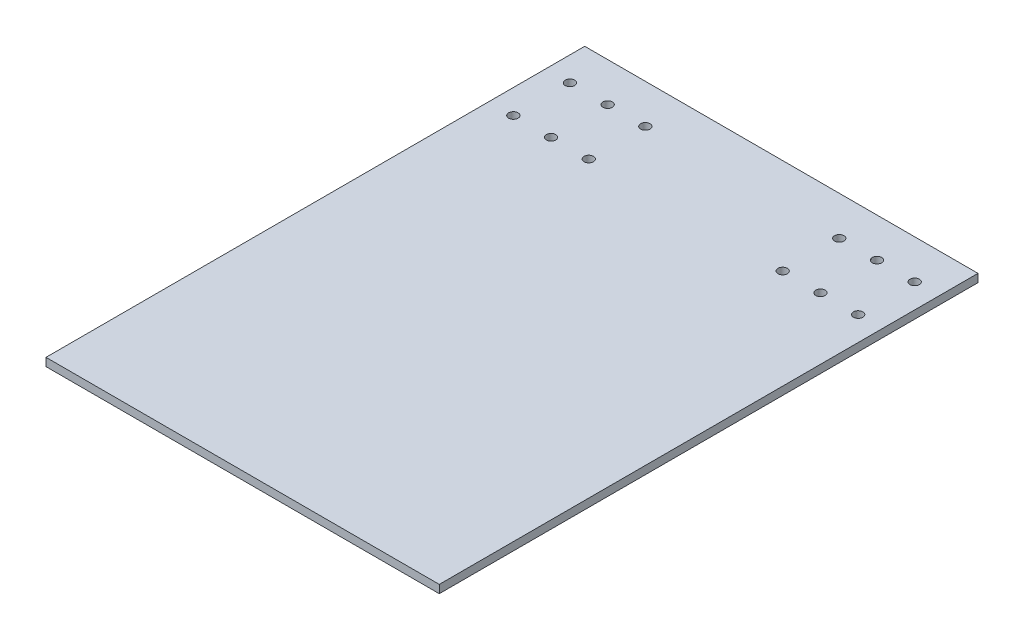
ISO-10303-21;
HEADER;
FILE_DESCRIPTION(('STEP AP214'),'2;1');
FILE_NAME('part.step','',(''),(''),'','','');
FILE_SCHEMA(('AUTOMOTIVE_DESIGN { 1 0 10303 214 1 1 1 1 }'));
ENDSEC;
DATA;
#1=APPLICATION_CONTEXT('core data for automotive mechanical design processes');
#2=APPLICATION_PROTOCOL_DEFINITION('international standard','automotive_design',2000,#1);
#3=PRODUCT_CONTEXT('',#1,'mechanical');
#4=PRODUCT('Part','Part','',(#3));
#5=PRODUCT_RELATED_PRODUCT_CATEGORY('part','',(#4));
#6=PRODUCT_DEFINITION_FORMATION('','',#4);
#7=PRODUCT_DEFINITION_CONTEXT('part definition',#1,'design');
#8=PRODUCT_DEFINITION('design','',#6,#7);
#9=PRODUCT_DEFINITION_SHAPE('','',#8);
#10=(LENGTH_UNIT() NAMED_UNIT(*) SI_UNIT(.MILLI.,.METRE.));
#11=(NAMED_UNIT(*) PLANE_ANGLE_UNIT() SI_UNIT($,.RADIAN.));
#12=(NAMED_UNIT(*) SI_UNIT($,.STERADIAN.) SOLID_ANGLE_UNIT());
#13=UNCERTAINTY_MEASURE_WITH_UNIT(LENGTH_MEASURE(1.E-05),#10,'distance_accuracy_value','');
#14=(GEOMETRIC_REPRESENTATION_CONTEXT(3) GLOBAL_UNCERTAINTY_ASSIGNED_CONTEXT((#13)) GLOBAL_UNIT_ASSIGNED_CONTEXT((#10,
#11,#12)) REPRESENTATION_CONTEXT('',''));
#15=CARTESIAN_POINT('',(0.,0.,0.));
#16=DIRECTION('',(0.,0.,1.));
#17=DIRECTION('',(1.,0.,0.));
#18=AXIS2_PLACEMENT_3D('',#15,#16,#17);
#19=CARTESIAN_POINT('',(0.,3.,0.));
#20=DIRECTION('',(0.,-1.,0.));
#21=DIRECTION('',(0.,0.,-1.));
#22=AXIS2_PLACEMENT_3D('',#19,#20,#21);
#23=PLANE('',#22);
#24=CARTESIAN_POINT('',(64.,3.,-64.5));
#25=DIRECTION('',(0.,1.,0.));
#26=DIRECTION('',(0.,0.,1.));
#27=AXIS2_PLACEMENT_3D('',#24,#25,#26);
#28=CIRCLE('',#27,1.74999999999999);
#29=CARTESIAN_POINT('',(64.,3.,-62.75));
#30=VERTEX_POINT('',#29);
#31=EDGE_CURVE('E169',#30,#30,#28,.T.);
#32=ORIENTED_EDGE('',*,*,#31,.F.);
#33=EDGE_LOOP('',(#32));
#34=FACE_BOUND('',#33,.T.);
#35=CARTESIAN_POINT('',(50.,3.,-64.5));
#36=DIRECTION('',(0.,1.,0.));
#37=DIRECTION('',(0.,0.,1.));
#38=AXIS2_PLACEMENT_3D('',#35,#36,#37);
#39=CIRCLE('',#38,1.74999999999999);
#40=CARTESIAN_POINT('',(50.,3.,-62.75));
#41=VERTEX_POINT('',#40);
#42=EDGE_CURVE('E157',#41,#41,#39,.T.);
#43=ORIENTED_EDGE('',*,*,#42,.F.);
#44=EDGE_LOOP('',(#43));
#45=FACE_BOUND('',#44,.T.);
#46=CARTESIAN_POINT('',(36.,3.,-64.5));
#47=DIRECTION('',(0.,1.,0.));
#48=DIRECTION('',(0.,0.,1.));
#49=AXIS2_PLACEMENT_3D('',#46,#47,#48);
#50=CIRCLE('',#49,1.75);
#51=CARTESIAN_POINT('',(36.,3.,-62.75));
#52=VERTEX_POINT('',#51);
#53=EDGE_CURVE('E145',#52,#52,#50,.T.);
#54=ORIENTED_EDGE('',*,*,#53,.F.);
#55=EDGE_LOOP('',(#54));
#56=FACE_BOUND('',#55,.T.);
#57=CARTESIAN_POINT('',(-36.,3.,-85.5));
#58=DIRECTION('',(0.,1.,0.));
#59=DIRECTION('',(0.,0.,1.));
#60=AXIS2_PLACEMENT_3D('',#57,#58,#59);
#61=CIRCLE('',#60,1.75);
#62=CARTESIAN_POINT('',(-36.,3.,-83.75));
#63=VERTEX_POINT('',#62);
#64=EDGE_CURVE('E133',#63,#63,#61,.T.);
#65=ORIENTED_EDGE('',*,*,#64,.F.);
#66=EDGE_LOOP('',(#65));
#67=FACE_BOUND('',#66,.T.);
#68=CARTESIAN_POINT('',(-50.,3.,-85.5));
#69=DIRECTION('',(0.,1.,0.));
#70=DIRECTION('',(0.,0.,1.));
#71=AXIS2_PLACEMENT_3D('',#68,#69,#70);
#72=CIRCLE('',#71,1.75);
#73=CARTESIAN_POINT('',(-50.,3.,-83.75));
#74=VERTEX_POINT('',#73);
#75=EDGE_CURVE('E121',#74,#74,#72,.T.);
#76=ORIENTED_EDGE('',*,*,#75,.F.);
#77=EDGE_LOOP('',(#76));
#78=FACE_BOUND('',#77,.T.);
#79=CARTESIAN_POINT('',(-64.,3.,-85.5));
#80=DIRECTION('',(0.,1.,0.));
#81=DIRECTION('',(0.,0.,1.));
#82=AXIS2_PLACEMENT_3D('',#79,#80,#81);
#83=CIRCLE('',#82,1.75);
#84=CARTESIAN_POINT('',(-64.,3.,-83.75));
#85=VERTEX_POINT('',#84);
#86=EDGE_CURVE('E100',#85,#85,#83,.T.);
#87=ORIENTED_EDGE('',*,*,#86,.F.);
#88=EDGE_LOOP('',(#87));
#89=FACE_BOUND('',#88,.T.);
#90=DIRECTION('',(0.,0.,-1.));
#91=VECTOR('',#90,1.);
#92=CARTESIAN_POINT('',(73.,3.,100.));
#93=LINE('',#92,#91);
#94=CARTESIAN_POINT('',(73.,3.,100.));
#95=VERTEX_POINT('',#94);
#96=CARTESIAN_POINT('',(73.,3.,-100.));
#97=VERTEX_POINT('',#96);
#98=EDGE_CURVE('E85',#95,#97,#93,.T.);
#99=ORIENTED_EDGE('',*,*,#98,.T.);
#100=DIRECTION('',(-1.,0.,0.));
#101=VECTOR('',#100,1.);
#102=CARTESIAN_POINT('',(-73.,3.,-100.));
#103=LINE('',#102,#101);
#104=CARTESIAN_POINT('',(-73.,3.,-100.));
#105=VERTEX_POINT('',#104);
#106=EDGE_CURVE('E80',#97,#105,#103,.T.);
#107=ORIENTED_EDGE('',*,*,#106,.T.);
#108=DIRECTION('',(0.,0.,1.));
#109=VECTOR('',#108,1.);
#110=CARTESIAN_POINT('',(-73.,3.,100.));
#111=LINE('',#110,#109);
#112=CARTESIAN_POINT('',(-73.,3.,100.));
#113=VERTEX_POINT('',#112);
#114=EDGE_CURVE('E83',#105,#113,#111,.T.);
#115=ORIENTED_EDGE('',*,*,#114,.T.);
#116=DIRECTION('',(1.,0.,0.));
#117=VECTOR('',#116,1.);
#118=CARTESIAN_POINT('',(-73.,3.,100.));
#119=LINE('',#118,#117);
#120=EDGE_CURVE('E50',#113,#95,#119,.T.);
#121=ORIENTED_EDGE('',*,*,#120,.T.);
#122=EDGE_LOOP('',(#99,#107,#115,#121));
#123=FACE_BOUND('',#122,.T.);
#124=CARTESIAN_POINT('',(-64.,3.,-64.5));
#125=DIRECTION('',(0.,1.,0.));
#126=DIRECTION('',(0.,0.,-1.));
#127=AXIS2_PLACEMENT_3D('',#124,#125,#126);
#128=CIRCLE('',#127,1.74999999999999);
#129=CARTESIAN_POINT('',(-64.,3.,-66.25));
#130=VERTEX_POINT('',#129);
#131=EDGE_CURVE('E115',#130,#130,#128,.T.);
#132=ORIENTED_EDGE('',*,*,#131,.F.);
#133=EDGE_LOOP('',(#132));
#134=FACE_BOUND('',#133,.T.);
#135=CARTESIAN_POINT('',(-50.,3.,-64.5));
#136=DIRECTION('',(0.,1.,0.));
#137=DIRECTION('',(0.,0.,-1.));
#138=AXIS2_PLACEMENT_3D('',#135,#136,#137);
#139=CIRCLE('',#138,1.74999999999999);
#140=CARTESIAN_POINT('',(-50.,3.,-66.25));
#141=VERTEX_POINT('',#140);
#142=EDGE_CURVE('E127',#141,#141,#139,.T.);
#143=ORIENTED_EDGE('',*,*,#142,.F.);
#144=EDGE_LOOP('',(#143));
#145=FACE_BOUND('',#144,.T.);
#146=CARTESIAN_POINT('',(-36.,3.,-64.5));
#147=DIRECTION('',(0.,1.,0.));
#148=DIRECTION('',(0.,0.,-1.));
#149=AXIS2_PLACEMENT_3D('',#146,#147,#148);
#150=CIRCLE('',#149,1.75);
#151=CARTESIAN_POINT('',(-36.,3.,-66.25));
#152=VERTEX_POINT('',#151);
#153=EDGE_CURVE('E139',#152,#152,#150,.T.);
#154=ORIENTED_EDGE('',*,*,#153,.F.);
#155=EDGE_LOOP('',(#154));
#156=FACE_BOUND('',#155,.T.);
#157=CARTESIAN_POINT('',(36.,3.,-85.5));
#158=DIRECTION('',(0.,1.,0.));
#159=DIRECTION('',(0.,0.,-1.));
#160=AXIS2_PLACEMENT_3D('',#157,#158,#159);
#161=CIRCLE('',#160,1.75);
#162=CARTESIAN_POINT('',(36.,3.,-87.25));
#163=VERTEX_POINT('',#162);
#164=EDGE_CURVE('E151',#163,#163,#161,.T.);
#165=ORIENTED_EDGE('',*,*,#164,.F.);
#166=EDGE_LOOP('',(#165));
#167=FACE_BOUND('',#166,.T.);
#168=CARTESIAN_POINT('',(50.,3.,-85.5));
#169=DIRECTION('',(0.,1.,0.));
#170=DIRECTION('',(0.,0.,-1.));
#171=AXIS2_PLACEMENT_3D('',#168,#169,#170);
#172=CIRCLE('',#171,1.75);
#173=CARTESIAN_POINT('',(50.,3.,-87.25));
#174=VERTEX_POINT('',#173);
#175=EDGE_CURVE('E163',#174,#174,#172,.T.);
#176=ORIENTED_EDGE('',*,*,#175,.F.);
#177=EDGE_LOOP('',(#176));
#178=FACE_BOUND('',#177,.T.);
#179=CARTESIAN_POINT('',(64.,3.,-85.5));
#180=DIRECTION('',(0.,1.,0.));
#181=DIRECTION('',(0.,0.,-1.));
#182=AXIS2_PLACEMENT_3D('',#179,#180,#181);
#183=CIRCLE('',#182,1.75);
#184=CARTESIAN_POINT('',(64.,3.,-87.25));
#185=VERTEX_POINT('',#184);
#186=EDGE_CURVE('E175',#185,#185,#183,.T.);
#187=ORIENTED_EDGE('',*,*,#186,.F.);
#188=EDGE_LOOP('',(#187));
#189=FACE_BOUND('',#188,.T.);
#190=ADVANCED_FACE('F33',(#34,#45,#56,#67,#78,#89,#123,#134,#145,#156,#167,#178,#189),#23,.F.);
#191=CARTESIAN_POINT('',(0.,0.,0.));
#192=DIRECTION('',(0.,-1.,0.));
#193=DIRECTION('',(0.,0.,-1.));
#194=AXIS2_PLACEMENT_3D('',#191,#192,#193);
#195=PLANE('',#194);
#196=CARTESIAN_POINT('',(64.,0.,-64.5));
#197=DIRECTION('',(0.,1.,0.));
#198=DIRECTION('',(0.,0.,1.));
#199=AXIS2_PLACEMENT_3D('',#196,#197,#198);
#200=CIRCLE('',#199,1.74999999999999);
#201=CARTESIAN_POINT('',(64.,0.,-62.75));
#202=VERTEX_POINT('',#201);
#203=EDGE_CURVE('E172',#202,#202,#200,.T.);
#204=ORIENTED_EDGE('',*,*,#203,.T.);
#205=EDGE_LOOP('',(#204));
#206=FACE_BOUND('',#205,.T.);
#207=CARTESIAN_POINT('',(50.,0.,-64.5));
#208=DIRECTION('',(0.,1.,0.));
#209=DIRECTION('',(0.,0.,1.));
#210=AXIS2_PLACEMENT_3D('',#207,#208,#209);
#211=CIRCLE('',#210,1.74999999999999);
#212=CARTESIAN_POINT('',(50.,0.,-62.75));
#213=VERTEX_POINT('',#212);
#214=EDGE_CURVE('E160',#213,#213,#211,.T.);
#215=ORIENTED_EDGE('',*,*,#214,.T.);
#216=EDGE_LOOP('',(#215));
#217=FACE_BOUND('',#216,.T.);
#218=CARTESIAN_POINT('',(36.,0.,-64.5));
#219=DIRECTION('',(0.,1.,0.));
#220=DIRECTION('',(0.,0.,1.));
#221=AXIS2_PLACEMENT_3D('',#218,#219,#220);
#222=CIRCLE('',#221,1.75);
#223=CARTESIAN_POINT('',(36.,0.,-62.75));
#224=VERTEX_POINT('',#223);
#225=EDGE_CURVE('E148',#224,#224,#222,.T.);
#226=ORIENTED_EDGE('',*,*,#225,.T.);
#227=EDGE_LOOP('',(#226));
#228=FACE_BOUND('',#227,.T.);
#229=CARTESIAN_POINT('',(-36.,0.,-85.5));
#230=DIRECTION('',(0.,1.,0.));
#231=DIRECTION('',(0.,0.,1.));
#232=AXIS2_PLACEMENT_3D('',#229,#230,#231);
#233=CIRCLE('',#232,1.75);
#234=CARTESIAN_POINT('',(-36.,0.,-83.75));
#235=VERTEX_POINT('',#234);
#236=EDGE_CURVE('E136',#235,#235,#233,.T.);
#237=ORIENTED_EDGE('',*,*,#236,.T.);
#238=EDGE_LOOP('',(#237));
#239=FACE_BOUND('',#238,.T.);
#240=CARTESIAN_POINT('',(-50.,0.,-85.5));
#241=DIRECTION('',(0.,1.,0.));
#242=DIRECTION('',(0.,0.,1.));
#243=AXIS2_PLACEMENT_3D('',#240,#241,#242);
#244=CIRCLE('',#243,1.75);
#245=CARTESIAN_POINT('',(-50.,0.,-83.75));
#246=VERTEX_POINT('',#245);
#247=EDGE_CURVE('E124',#246,#246,#244,.T.);
#248=ORIENTED_EDGE('',*,*,#247,.T.);
#249=EDGE_LOOP('',(#248));
#250=FACE_BOUND('',#249,.T.);
#251=CARTESIAN_POINT('',(-64.,0.,-85.5));
#252=DIRECTION('',(0.,1.,0.));
#253=DIRECTION('',(0.,0.,1.));
#254=AXIS2_PLACEMENT_3D('',#251,#252,#253);
#255=CIRCLE('',#254,1.75);
#256=CARTESIAN_POINT('',(-64.,0.,-83.75));
#257=VERTEX_POINT('',#256);
#258=EDGE_CURVE('E112',#257,#257,#255,.T.);
#259=ORIENTED_EDGE('',*,*,#258,.T.);
#260=EDGE_LOOP('',(#259));
#261=FACE_BOUND('',#260,.T.);
#262=DIRECTION('',(0.,0.,-1.));
#263=VECTOR('',#262,1.);
#264=CARTESIAN_POINT('',(73.,0.,100.));
#265=LINE('',#264,#263);
#266=CARTESIAN_POINT('',(73.,0.,100.));
#267=VERTEX_POINT('',#266);
#268=CARTESIAN_POINT('',(73.,0.,-100.));
#269=VERTEX_POINT('',#268);
#270=EDGE_CURVE('E97',#267,#269,#265,.T.);
#271=ORIENTED_EDGE('',*,*,#270,.F.);
#272=DIRECTION('',(1.,0.,0.));
#273=VECTOR('',#272,1.);
#274=CARTESIAN_POINT('',(-73.,0.,100.));
#275=LINE('',#274,#273);
#276=CARTESIAN_POINT('',(-73.,0.,100.));
#277=VERTEX_POINT('',#276);
#278=EDGE_CURVE('E73',#277,#267,#275,.T.);
#279=ORIENTED_EDGE('',*,*,#278,.F.);
#280=DIRECTION('',(0.,0.,1.));
#281=VECTOR('',#280,1.);
#282=CARTESIAN_POINT('',(-73.,0.,100.));
#283=LINE('',#282,#281);
#284=CARTESIAN_POINT('',(-73.,0.,-100.));
#285=VERTEX_POINT('',#284);
#286=EDGE_CURVE('E67',#285,#277,#283,.T.);
#287=ORIENTED_EDGE('',*,*,#286,.F.);
#288=DIRECTION('',(-1.,0.,0.));
#289=VECTOR('',#288,1.);
#290=CARTESIAN_POINT('',(-73.,0.,-100.));
#291=LINE('',#290,#289);
#292=EDGE_CURVE('E89',#269,#285,#291,.T.);
#293=ORIENTED_EDGE('',*,*,#292,.F.);
#294=EDGE_LOOP('',(#271,#279,#287,#293));
#295=FACE_BOUND('',#294,.T.);
#296=CARTESIAN_POINT('',(-64.,0.,-64.5));
#297=DIRECTION('',(0.,1.,0.));
#298=DIRECTION('',(0.,0.,-1.));
#299=AXIS2_PLACEMENT_3D('',#296,#297,#298);
#300=CIRCLE('',#299,1.74999999999999);
#301=CARTESIAN_POINT('',(-64.,0.,-66.25));
#302=VERTEX_POINT('',#301);
#303=EDGE_CURVE('E118',#302,#302,#300,.T.);
#304=ORIENTED_EDGE('',*,*,#303,.T.);
#305=EDGE_LOOP('',(#304));
#306=FACE_BOUND('',#305,.T.);
#307=CARTESIAN_POINT('',(-50.,0.,-64.5));
#308=DIRECTION('',(0.,1.,0.));
#309=DIRECTION('',(0.,0.,-1.));
#310=AXIS2_PLACEMENT_3D('',#307,#308,#309);
#311=CIRCLE('',#310,1.74999999999999);
#312=CARTESIAN_POINT('',(-50.,0.,-66.25));
#313=VERTEX_POINT('',#312);
#314=EDGE_CURVE('E130',#313,#313,#311,.T.);
#315=ORIENTED_EDGE('',*,*,#314,.T.);
#316=EDGE_LOOP('',(#315));
#317=FACE_BOUND('',#316,.T.);
#318=CARTESIAN_POINT('',(-36.,0.,-64.5));
#319=DIRECTION('',(0.,1.,0.));
#320=DIRECTION('',(0.,0.,-1.));
#321=AXIS2_PLACEMENT_3D('',#318,#319,#320);
#322=CIRCLE('',#321,1.75);
#323=CARTESIAN_POINT('',(-36.,0.,-66.25));
#324=VERTEX_POINT('',#323);
#325=EDGE_CURVE('E142',#324,#324,#322,.T.);
#326=ORIENTED_EDGE('',*,*,#325,.T.);
#327=EDGE_LOOP('',(#326));
#328=FACE_BOUND('',#327,.T.);
#329=CARTESIAN_POINT('',(36.,0.,-85.5));
#330=DIRECTION('',(0.,1.,0.));
#331=DIRECTION('',(0.,0.,-1.));
#332=AXIS2_PLACEMENT_3D('',#329,#330,#331);
#333=CIRCLE('',#332,1.75);
#334=CARTESIAN_POINT('',(36.,0.,-87.25));
#335=VERTEX_POINT('',#334);
#336=EDGE_CURVE('E154',#335,#335,#333,.T.);
#337=ORIENTED_EDGE('',*,*,#336,.T.);
#338=EDGE_LOOP('',(#337));
#339=FACE_BOUND('',#338,.T.);
#340=CARTESIAN_POINT('',(50.,0.,-85.5));
#341=DIRECTION('',(0.,1.,0.));
#342=DIRECTION('',(0.,0.,-1.));
#343=AXIS2_PLACEMENT_3D('',#340,#341,#342);
#344=CIRCLE('',#343,1.75);
#345=CARTESIAN_POINT('',(50.,0.,-87.25));
#346=VERTEX_POINT('',#345);
#347=EDGE_CURVE('E166',#346,#346,#344,.T.);
#348=ORIENTED_EDGE('',*,*,#347,.T.);
#349=EDGE_LOOP('',(#348));
#350=FACE_BOUND('',#349,.T.);
#351=CARTESIAN_POINT('',(64.,0.,-85.5));
#352=DIRECTION('',(0.,1.,0.));
#353=DIRECTION('',(0.,0.,-1.));
#354=AXIS2_PLACEMENT_3D('',#351,#352,#353);
#355=CIRCLE('',#354,1.75);
#356=CARTESIAN_POINT('',(64.,0.,-87.25));
#357=VERTEX_POINT('',#356);
#358=EDGE_CURVE('E178',#357,#357,#355,.T.);
#359=ORIENTED_EDGE('',*,*,#358,.T.);
#360=EDGE_LOOP('',(#359));
#361=FACE_BOUND('',#360,.T.);
#362=ADVANCED_FACE('F108',(#206,#217,#228,#239,#250,#261,#295,#306,#317,#328,#339,#350,#361),
#195,.T.);
#363=CARTESIAN_POINT('',(73.,3.,100.));
#364=DIRECTION('',(-1.,0.,0.));
#365=DIRECTION('',(0.,0.,1.));
#366=AXIS2_PLACEMENT_3D('',#363,#364,#365);
#367=PLANE('',#366);
#368=ORIENTED_EDGE('',*,*,#270,.T.);
#369=DIRECTION('',(0.,-1.,0.));
#370=VECTOR('',#369,1.);
#371=CARTESIAN_POINT('',(73.,3.,-100.));
#372=LINE('',#371,#370);
#373=EDGE_CURVE('E11',#97,#269,#372,.T.);
#374=ORIENTED_EDGE('',*,*,#373,.F.);
#375=ORIENTED_EDGE('',*,*,#98,.F.);
#376=DIRECTION('',(0.,-1.,0.));
#377=VECTOR('',#376,1.);
#378=CARTESIAN_POINT('',(73.,3.,100.));
#379=LINE('',#378,#377);
#380=EDGE_CURVE('E93',#95,#267,#379,.T.);
#381=ORIENTED_EDGE('',*,*,#380,.T.);
#382=EDGE_LOOP('',(#368,#374,#375,#381));
#383=FACE_BOUND('',#382,.T.);
#384=ADVANCED_FACE('F35',(#383),#367,.F.);
#385=CARTESIAN_POINT('',(-73.,3.,-100.));
#386=DIRECTION('',(0.,0.,1.));
#387=DIRECTION('',(1.,0.,0.));
#388=AXIS2_PLACEMENT_3D('',#385,#386,#387);
#389=PLANE('',#388);
#390=ORIENTED_EDGE('',*,*,#292,.T.);
#391=DIRECTION('',(0.,-1.,0.));
#392=VECTOR('',#391,1.);
#393=CARTESIAN_POINT('',(-73.,3.,-100.));
#394=LINE('',#393,#392);
#395=EDGE_CURVE('E42',#105,#285,#394,.T.);
#396=ORIENTED_EDGE('',*,*,#395,.F.);
#397=ORIENTED_EDGE('',*,*,#106,.F.);
#398=ORIENTED_EDGE('',*,*,#373,.T.);
#399=EDGE_LOOP('',(#390,#396,#397,#398));
#400=FACE_BOUND('',#399,.T.);
#401=ADVANCED_FACE('F88',(#400),#389,.F.);
#402=CARTESIAN_POINT('',(-73.,3.,100.));
#403=DIRECTION('',(1.,0.,0.));
#404=DIRECTION('',(0.,0.,-1.));
#405=AXIS2_PLACEMENT_3D('',#402,#403,#404);
#406=PLANE('',#405);
#407=ORIENTED_EDGE('',*,*,#286,.T.);
#408=DIRECTION('',(0.,-1.,0.));
#409=VECTOR('',#408,1.);
#410=CARTESIAN_POINT('',(-73.,3.,100.));
#411=LINE('',#410,#409);
#412=EDGE_CURVE('E90',#113,#277,#411,.T.);
#413=ORIENTED_EDGE('',*,*,#412,.F.);
#414=ORIENTED_EDGE('',*,*,#114,.F.);
#415=ORIENTED_EDGE('',*,*,#395,.T.);
#416=EDGE_LOOP('',(#407,#413,#414,#415));
#417=FACE_BOUND('',#416,.T.);
#418=ADVANCED_FACE('F91',(#417),#406,.F.);
#419=CARTESIAN_POINT('',(-73.,3.,100.));
#420=DIRECTION('',(0.,0.,-1.));
#421=DIRECTION('',(-1.,0.,0.));
#422=AXIS2_PLACEMENT_3D('',#419,#420,#421);
#423=PLANE('',#422);
#424=ORIENTED_EDGE('',*,*,#278,.T.);
#425=ORIENTED_EDGE('',*,*,#380,.F.);
#426=ORIENTED_EDGE('',*,*,#120,.F.);
#427=ORIENTED_EDGE('',*,*,#412,.T.);
#428=EDGE_LOOP('',(#424,#425,#426,#427));
#429=FACE_BOUND('',#428,.T.);
#430=ADVANCED_FACE('F105',(#429),#423,.F.);
#431=CARTESIAN_POINT('',(-64.,3.,-85.5));
#432=DIRECTION('',(0.,-1.,0.));
#433=DIRECTION('',(0.,0.,-1.));
#434=AXIS2_PLACEMENT_3D('',#431,#432,#433);
#435=CYLINDRICAL_SURFACE('',#434,1.75);
#436=ORIENTED_EDGE('',*,*,#86,.T.);
#437=EDGE_LOOP('',(#436));
#438=FACE_BOUND('',#437,.T.);
#439=ORIENTED_EDGE('',*,*,#258,.F.);
#440=EDGE_LOOP('',(#439));
#441=FACE_BOUND('',#440,.T.);
#442=ADVANCED_FACE('F198',(#438,#441),#435,.F.);
#443=CARTESIAN_POINT('',(-64.,3.,-64.5));
#444=DIRECTION('',(0.,-1.,0.));
#445=DIRECTION('',(0.,0.,-1.));
#446=AXIS2_PLACEMENT_3D('',#443,#444,#445);
#447=CYLINDRICAL_SURFACE('',#446,1.74999999999999);
#448=ORIENTED_EDGE('',*,*,#131,.T.);
#449=EDGE_LOOP('',(#448));
#450=FACE_BOUND('',#449,.T.);
#451=ORIENTED_EDGE('',*,*,#303,.F.);
#452=EDGE_LOOP('',(#451));
#453=FACE_BOUND('',#452,.T.);
#454=ADVANCED_FACE('F244',(#450,#453),#447,.F.);
#455=CARTESIAN_POINT('',(-50.,3.,-85.5));
#456=DIRECTION('',(0.,-1.,0.));
#457=DIRECTION('',(0.,0.,-1.));
#458=AXIS2_PLACEMENT_3D('',#455,#456,#457);
#459=CYLINDRICAL_SURFACE('',#458,1.75);
#460=ORIENTED_EDGE('',*,*,#75,.T.);
#461=EDGE_LOOP('',(#460));
#462=FACE_BOUND('',#461,.T.);
#463=ORIENTED_EDGE('',*,*,#247,.F.);
#464=EDGE_LOOP('',(#463));
#465=FACE_BOUND('',#464,.T.);
#466=ADVANCED_FACE('F252',(#462,#465),#459,.F.);
#467=CARTESIAN_POINT('',(-50.,3.,-64.5));
#468=DIRECTION('',(0.,-1.,0.));
#469=DIRECTION('',(0.,0.,-1.));
#470=AXIS2_PLACEMENT_3D('',#467,#468,#469);
#471=CYLINDRICAL_SURFACE('',#470,1.74999999999999);
#472=ORIENTED_EDGE('',*,*,#142,.T.);
#473=EDGE_LOOP('',(#472));
#474=FACE_BOUND('',#473,.T.);
#475=ORIENTED_EDGE('',*,*,#314,.F.);
#476=EDGE_LOOP('',(#475));
#477=FACE_BOUND('',#476,.T.);
#478=ADVANCED_FACE('F260',(#474,#477),#471,.F.);
#479=CARTESIAN_POINT('',(-36.,3.,-85.5));
#480=DIRECTION('',(0.,-1.,0.));
#481=DIRECTION('',(0.,0.,-1.));
#482=AXIS2_PLACEMENT_3D('',#479,#480,#481);
#483=CYLINDRICAL_SURFACE('',#482,1.75);
#484=ORIENTED_EDGE('',*,*,#64,.T.);
#485=EDGE_LOOP('',(#484));
#486=FACE_BOUND('',#485,.T.);
#487=ORIENTED_EDGE('',*,*,#236,.F.);
#488=EDGE_LOOP('',(#487));
#489=FACE_BOUND('',#488,.T.);
#490=ADVANCED_FACE('F269',(#486,#489),#483,.F.);
#491=CARTESIAN_POINT('',(-36.,3.,-64.5));
#492=DIRECTION('',(0.,-1.,0.));
#493=DIRECTION('',(0.,0.,-1.));
#494=AXIS2_PLACEMENT_3D('',#491,#492,#493);
#495=CYLINDRICAL_SURFACE('',#494,1.75);
#496=ORIENTED_EDGE('',*,*,#153,.T.);
#497=EDGE_LOOP('',(#496));
#498=FACE_BOUND('',#497,.T.);
#499=ORIENTED_EDGE('',*,*,#325,.F.);
#500=EDGE_LOOP('',(#499));
#501=FACE_BOUND('',#500,.T.);
#502=ADVANCED_FACE('F278',(#498,#501),#495,.F.);
#503=CARTESIAN_POINT('',(36.,3.,-64.5));
#504=DIRECTION('',(0.,-1.,0.));
#505=DIRECTION('',(0.,0.,-1.));
#506=AXIS2_PLACEMENT_3D('',#503,#504,#505);
#507=CYLINDRICAL_SURFACE('',#506,1.75);
#508=ORIENTED_EDGE('',*,*,#53,.T.);
#509=EDGE_LOOP('',(#508));
#510=FACE_BOUND('',#509,.T.);
#511=ORIENTED_EDGE('',*,*,#225,.F.);
#512=EDGE_LOOP('',(#511));
#513=FACE_BOUND('',#512,.T.);
#514=ADVANCED_FACE('F287',(#510,#513),#507,.F.);
#515=CARTESIAN_POINT('',(36.,3.,-85.5));
#516=DIRECTION('',(0.,-1.,0.));
#517=DIRECTION('',(0.,0.,-1.));
#518=AXIS2_PLACEMENT_3D('',#515,#516,#517);
#519=CYLINDRICAL_SURFACE('',#518,1.75);
#520=ORIENTED_EDGE('',*,*,#164,.T.);
#521=EDGE_LOOP('',(#520));
#522=FACE_BOUND('',#521,.T.);
#523=ORIENTED_EDGE('',*,*,#336,.F.);
#524=EDGE_LOOP('',(#523));
#525=FACE_BOUND('',#524,.T.);
#526=ADVANCED_FACE('F296',(#522,#525),#519,.F.);
#527=CARTESIAN_POINT('',(50.,3.,-64.5));
#528=DIRECTION('',(0.,-1.,0.));
#529=DIRECTION('',(0.,0.,-1.));
#530=AXIS2_PLACEMENT_3D('',#527,#528,#529);
#531=CYLINDRICAL_SURFACE('',#530,1.74999999999999);
#532=ORIENTED_EDGE('',*,*,#42,.T.);
#533=EDGE_LOOP('',(#532));
#534=FACE_BOUND('',#533,.T.);
#535=ORIENTED_EDGE('',*,*,#214,.F.);
#536=EDGE_LOOP('',(#535));
#537=FACE_BOUND('',#536,.T.);
#538=ADVANCED_FACE('F305',(#534,#537),#531,.F.);
#539=CARTESIAN_POINT('',(50.,3.,-85.5));
#540=DIRECTION('',(0.,-1.,0.));
#541=DIRECTION('',(0.,0.,-1.));
#542=AXIS2_PLACEMENT_3D('',#539,#540,#541);
#543=CYLINDRICAL_SURFACE('',#542,1.75);
#544=ORIENTED_EDGE('',*,*,#175,.T.);
#545=EDGE_LOOP('',(#544));
#546=FACE_BOUND('',#545,.T.);
#547=ORIENTED_EDGE('',*,*,#347,.F.);
#548=EDGE_LOOP('',(#547));
#549=FACE_BOUND('',#548,.T.);
#550=ADVANCED_FACE('F314',(#546,#549),#543,.F.);
#551=CARTESIAN_POINT('',(64.,3.,-64.5));
#552=DIRECTION('',(0.,-1.,0.));
#553=DIRECTION('',(0.,0.,-1.));
#554=AXIS2_PLACEMENT_3D('',#551,#552,#553);
#555=CYLINDRICAL_SURFACE('',#554,1.74999999999999);
#556=ORIENTED_EDGE('',*,*,#31,.T.);
#557=EDGE_LOOP('',(#556));
#558=FACE_BOUND('',#557,.T.);
#559=ORIENTED_EDGE('',*,*,#203,.F.);
#560=EDGE_LOOP('',(#559));
#561=FACE_BOUND('',#560,.T.);
#562=ADVANCED_FACE('F323',(#558,#561),#555,.F.);
#563=CARTESIAN_POINT('',(64.,3.,-85.5));
#564=DIRECTION('',(0.,-1.,0.));
#565=DIRECTION('',(0.,0.,-1.));
#566=AXIS2_PLACEMENT_3D('',#563,#564,#565);
#567=CYLINDRICAL_SURFACE('',#566,1.75);
#568=ORIENTED_EDGE('',*,*,#186,.T.);
#569=EDGE_LOOP('',(#568));
#570=FACE_BOUND('',#569,.T.);
#571=ORIENTED_EDGE('',*,*,#358,.F.);
#572=EDGE_LOOP('',(#571));
#573=FACE_BOUND('',#572,.T.);
#574=ADVANCED_FACE('F184',(#570,#573),#567,.F.);
#575=CLOSED_SHELL('',(#190,#362,#384,#401,#418,#430,#442,#454,#466,#478,#490,#502,#514,#526,
#538,#550,#562,#574));
#576=MANIFOLD_SOLID_BREP('B2',#575);
#577=ADVANCED_BREP_SHAPE_REPRESENTATION('',(#18,#576),#14);
#578=SHAPE_DEFINITION_REPRESENTATION(#9,#577);
ENDSEC;
END-ISO-10303-21;
